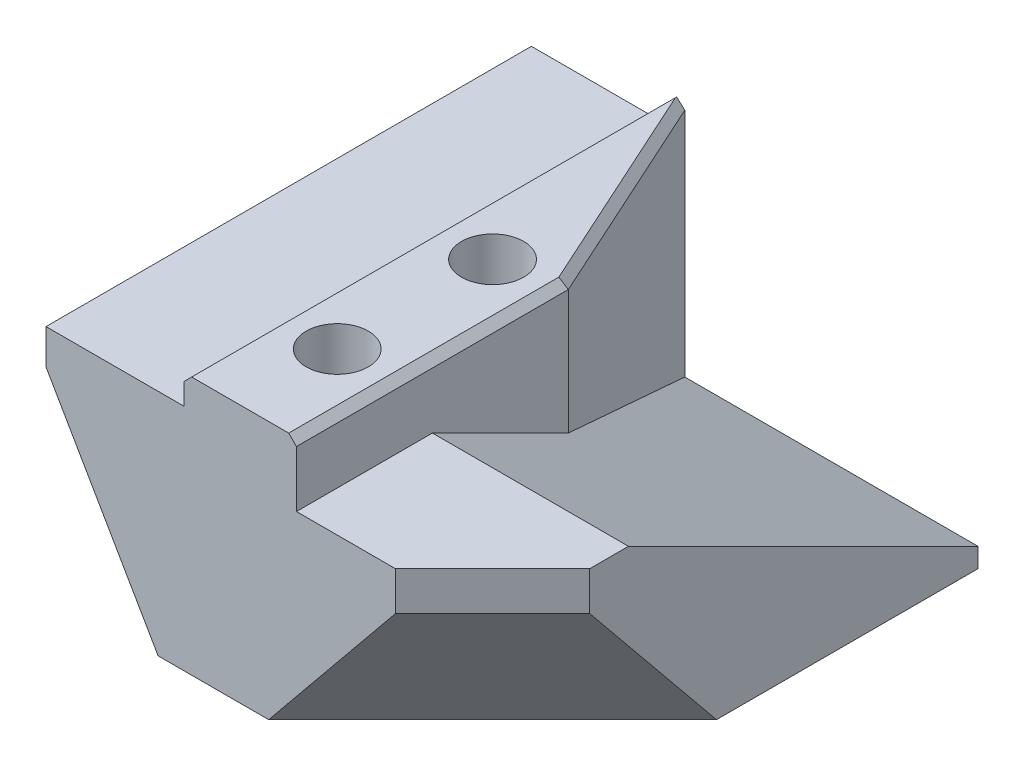
ISO-10303-21;
HEADER;
FILE_DESCRIPTION(('STEP AP214'),'2;1');
FILE_NAME('part.step','',(''),(''),'','','');
FILE_SCHEMA(('AUTOMOTIVE_DESIGN { 1 0 10303 214 1 1 1 1 }'));
ENDSEC;
DATA;
#1=APPLICATION_CONTEXT('core data for automotive mechanical design processes');
#2=APPLICATION_PROTOCOL_DEFINITION('international standard','automotive_design',2000,#1);
#3=PRODUCT_CONTEXT('',#1,'mechanical');
#4=PRODUCT('Part','Part','',(#3));
#5=PRODUCT_RELATED_PRODUCT_CATEGORY('part','',(#4));
#6=PRODUCT_DEFINITION_FORMATION('','',#4);
#7=PRODUCT_DEFINITION_CONTEXT('part definition',#1,'design');
#8=PRODUCT_DEFINITION('design','',#6,#7);
#9=PRODUCT_DEFINITION_SHAPE('','',#8);
#10=(LENGTH_UNIT() NAMED_UNIT(*) SI_UNIT(.MILLI.,.METRE.));
#11=(NAMED_UNIT(*) PLANE_ANGLE_UNIT() SI_UNIT($,.RADIAN.));
#12=(NAMED_UNIT(*) SI_UNIT($,.STERADIAN.) SOLID_ANGLE_UNIT());
#13=UNCERTAINTY_MEASURE_WITH_UNIT(LENGTH_MEASURE(1.E-05),#10,'distance_accuracy_value','');
#14=(GEOMETRIC_REPRESENTATION_CONTEXT(3) GLOBAL_UNCERTAINTY_ASSIGNED_CONTEXT((#13)) GLOBAL_UNIT_ASSIGNED_CONTEXT((#10,
#11,#12)) REPRESENTATION_CONTEXT('',''));
#15=CARTESIAN_POINT('',(0.,0.,0.));
#16=DIRECTION('',(0.,0.,1.));
#17=DIRECTION('',(1.,0.,0.));
#18=AXIS2_PLACEMENT_3D('',#15,#16,#17);
#19=CARTESIAN_POINT('',(12.9,7.8,-20.));
#20=DIRECTION('',(-1.,0.,0.));
#21=DIRECTION('',(0.,0.,1.));
#22=AXIS2_PLACEMENT_3D('',#19,#20,#21);
#23=PLANE('',#22);
#24=DIRECTION('',(0.,1.,0.));
#25=VECTOR('',#24,1.);
#26=CARTESIAN_POINT('',(12.9,-13.0461510298504,-14.));
#27=LINE('',#26,#25);
#28=CARTESIAN_POINT('',(12.9,2.5,-14.));
#29=VERTEX_POINT('',#28);
#30=CARTESIAN_POINT('',(12.9,8.9,-14.));
#31=VERTEX_POINT('',#30);
#32=EDGE_CURVE('E172',#29,#31,#27,.T.);
#33=ORIENTED_EDGE('',*,*,#32,.T.);
#34=DIRECTION('',(0.,0.,1.));
#35=VECTOR('',#34,1.);
#36=CARTESIAN_POINT('',(12.9,8.9,0.));
#37=LINE('',#36,#35);
#38=CARTESIAN_POINT('',(12.9,8.9,0.));
#39=VERTEX_POINT('',#38);
#40=EDGE_CURVE('E65',#31,#39,#37,.T.);
#41=ORIENTED_EDGE('',*,*,#40,.T.);
#42=DIRECTION('',(0.,-1.,0.));
#43=VECTOR('',#42,1.);
#44=CARTESIAN_POINT('',(12.9,7.8,0.));
#45=LINE('',#44,#43);
#46=CARTESIAN_POINT('',(12.9,6.,0.));
#47=VERTEX_POINT('',#46);
#48=EDGE_CURVE('E238',#39,#47,#45,.T.);
#49=ORIENTED_EDGE('',*,*,#48,.T.);
#50=DIRECTION('',(0.,0.,1.));
#51=VECTOR('',#50,1.);
#52=CARTESIAN_POINT('',(12.9,6.,-20.));
#53=LINE('',#52,#51);
#54=CARTESIAN_POINT('',(12.9,6.,-7.));
#55=VERTEX_POINT('',#54);
#56=EDGE_CURVE('E201',#55,#47,#53,.T.);
#57=ORIENTED_EDGE('',*,*,#56,.F.);
#58=DIRECTION('',(0.,-0.447213595499958,-0.894427190999916));
#59=VECTOR('',#58,1.);
#60=CARTESIAN_POINT('',(12.9,6.,-7.));
#61=LINE('',#60,#59);
#62=EDGE_CURVE('E164',#55,#29,#61,.T.);
#63=ORIENTED_EDGE('',*,*,#62,.T.);
#64=EDGE_LOOP('',(#33,#41,#49,#57,#63));
#65=FACE_BOUND('',#64,.T.);
#66=ADVANCED_FACE('F39',(#65),#23,.F.);
#67=CARTESIAN_POINT('',(10.,7.8,-13.));
#68=DIRECTION('',(0.,-1.,0.));
#69=DIRECTION('',(0.,0.,-1.));
#70=AXIS2_PLACEMENT_3D('',#67,#68,#69);
#71=CYLINDRICAL_SURFACE('',#70,1.6);
#72=CARTESIAN_POINT('',(10.,3.90000000000001,-13.));
#73=DIRECTION('',(0.,-1.,0.));
#74=DIRECTION('',(0.,0.,-1.));
#75=AXIS2_PLACEMENT_3D('',#72,#73,#74);
#76=CIRCLE('',#75,1.6);
#77=CARTESIAN_POINT('',(10.,3.90000000000001,-14.6));
#78=VERTEX_POINT('',#77);
#79=EDGE_CURVE('E269',#78,#78,#76,.T.);
#80=ORIENTED_EDGE('',*,*,#79,.T.);
#81=EDGE_LOOP('',(#80));
#82=FACE_BOUND('',#81,.T.);
#83=CARTESIAN_POINT('',(10.,9.3,-13.));
#84=DIRECTION('',(0.,1.,0.));
#85=DIRECTION('',(0.,0.,1.));
#86=AXIS2_PLACEMENT_3D('',#83,#84,#85);
#87=CIRCLE('',#86,1.6);
#88=CARTESIAN_POINT('',(10.,9.3,-11.4));
#89=VERTEX_POINT('',#88);
#90=EDGE_CURVE('E221',#89,#89,#87,.T.);
#91=ORIENTED_EDGE('',*,*,#90,.T.);
#92=EDGE_LOOP('',(#91));
#93=FACE_BOUND('',#92,.T.);
#94=ADVANCED_FACE('F359',(#82,#93),#71,.F.);
#95=CARTESIAN_POINT('',(10.,7.8,-5.));
#96=DIRECTION('',(0.,-1.,0.));
#97=DIRECTION('',(0.,0.,-1.));
#98=AXIS2_PLACEMENT_3D('',#95,#96,#97);
#99=CYLINDRICAL_SURFACE('',#98,1.6);
#100=CARTESIAN_POINT('',(10.,3.90000000000001,-5.));
#101=DIRECTION('',(0.,-1.,0.));
#102=DIRECTION('',(0.,0.,-1.));
#103=AXIS2_PLACEMENT_3D('',#100,#101,#102);
#104=CIRCLE('',#103,1.6);
#105=CARTESIAN_POINT('',(10.,3.90000000000001,-6.6));
#106=VERTEX_POINT('',#105);
#107=EDGE_CURVE('E272',#106,#106,#104,.T.);
#108=ORIENTED_EDGE('',*,*,#107,.T.);
#109=EDGE_LOOP('',(#108));
#110=FACE_BOUND('',#109,.T.);
#111=CARTESIAN_POINT('',(10.,9.3,-5.));
#112=DIRECTION('',(0.,1.,0.));
#113=DIRECTION('',(0.,0.,1.));
#114=AXIS2_PLACEMENT_3D('',#111,#112,#113);
#115=CIRCLE('',#114,1.6);
#116=CARTESIAN_POINT('',(10.,9.3,-3.4));
#117=VERTEX_POINT('',#116);
#118=EDGE_CURVE('E218',#117,#117,#115,.T.);
#119=ORIENTED_EDGE('',*,*,#118,.T.);
#120=EDGE_LOOP('',(#119));
#121=FACE_BOUND('',#120,.T.);
#122=ADVANCED_FACE('F357',(#110,#121),#99,.F.);
#123=CARTESIAN_POINT('',(0.,4.,0.));
#124=DIRECTION('',(1.,0.,0.));
#125=DIRECTION('',(0.,0.,-1.));
#126=AXIS2_PLACEMENT_3D('',#123,#124,#125);
#127=PLANE('',#126);
#128=DIRECTION('',(0.,1.,0.));
#129=VECTOR('',#128,1.);
#130=CARTESIAN_POINT('',(0.,-4.,-25.));
#131=LINE('',#130,#129);
#132=CARTESIAN_POINT('',(0.,6.00000000000006,-25.));
#133=VERTEX_POINT('',#132);
#134=CARTESIAN_POINT('',(0.,7.8,-25.));
#135=VERTEX_POINT('',#134);
#136=EDGE_CURVE('E190',#133,#135,#131,.T.);
#137=ORIENTED_EDGE('',*,*,#136,.F.);
#138=DIRECTION('',(0.,0.,1.));
#139=VECTOR('',#138,1.);
#140=CARTESIAN_POINT('',(0.,6.00000000000006,0.));
#141=LINE('',#140,#139);
#142=CARTESIAN_POINT('',(0.,6.00000000000006,0.));
#143=VERTEX_POINT('',#142);
#144=EDGE_CURVE('E248',#133,#143,#141,.T.);
#145=ORIENTED_EDGE('',*,*,#144,.T.);
#146=DIRECTION('',(0.,-1.,0.));
#147=VECTOR('',#146,1.);
#148=CARTESIAN_POINT('',(0.,4.,0.));
#149=LINE('',#148,#147);
#150=CARTESIAN_POINT('',(0.,7.8,0.));
#151=VERTEX_POINT('',#150);
#152=EDGE_CURVE('E240',#151,#143,#149,.T.);
#153=ORIENTED_EDGE('',*,*,#152,.F.);
#154=DIRECTION('',(0.,0.,1.));
#155=VECTOR('',#154,1.);
#156=CARTESIAN_POINT('',(0.,7.8,-20.));
#157=LINE('',#156,#155);
#158=EDGE_CURVE('E232',#135,#151,#157,.T.);
#159=ORIENTED_EDGE('',*,*,#158,.F.);
#160=EDGE_LOOP('',(#137,#145,#153,#159));
#161=FACE_BOUND('',#160,.T.);
#162=ADVANCED_FACE('F332',(#161),#127,.F.);
#163=CARTESIAN_POINT('',(0.,4.,0.));
#164=DIRECTION('',(0.,0.,-1.));
#165=DIRECTION('',(-1.,0.,0.));
#166=AXIS2_PLACEMENT_3D('',#163,#164,#165);
#167=PLANE('',#166);
#168=ORIENTED_EDGE('',*,*,#48,.F.);
#169=DIRECTION('',(-0.707106781186548,0.707106781186548,0.));
#170=VECTOR('',#169,1.);
#171=CARTESIAN_POINT('',(12.5,9.3,0.));
#172=LINE('',#171,#170);
#173=CARTESIAN_POINT('',(12.5,9.3,0.));
#174=VERTEX_POINT('',#173);
#175=EDGE_CURVE('E49',#39,#174,#172,.T.);
#176=ORIENTED_EDGE('',*,*,#175,.T.);
#177=DIRECTION('',(1.,0.,0.));
#178=VECTOR('',#177,1.);
#179=CARTESIAN_POINT('',(7.1,9.3,0.));
#180=LINE('',#179,#178);
#181=CARTESIAN_POINT('',(7.5,9.3,0.));
#182=VERTEX_POINT('',#181);
#183=EDGE_CURVE('E225',#182,#174,#180,.T.);
#184=ORIENTED_EDGE('',*,*,#183,.F.);
#185=DIRECTION('',(-0.707106781186548,-0.707106781186548,0.));
#186=VECTOR('',#185,1.);
#187=CARTESIAN_POINT('',(7.5,9.3,0.));
#188=LINE('',#187,#186);
#189=CARTESIAN_POINT('',(7.1,8.9,0.));
#190=VERTEX_POINT('',#189);
#191=EDGE_CURVE('E57',#182,#190,#188,.T.);
#192=ORIENTED_EDGE('',*,*,#191,.T.);
#193=DIRECTION('',(0.,-1.,0.));
#194=VECTOR('',#193,1.);
#195=CARTESIAN_POINT('',(7.1,9.3,0.));
#196=LINE('',#195,#194);
#197=CARTESIAN_POINT('',(7.1,7.8,0.));
#198=VERTEX_POINT('',#197);
#199=EDGE_CURVE('E228',#190,#198,#196,.T.);
#200=ORIENTED_EDGE('',*,*,#199,.T.);
#201=DIRECTION('',(1.,0.,0.));
#202=VECTOR('',#201,1.);
#203=CARTESIAN_POINT('',(0.,7.8,0.));
#204=LINE('',#203,#202);
#205=EDGE_CURVE('E235',#151,#198,#204,.T.);
#206=ORIENTED_EDGE('',*,*,#205,.F.);
#207=ORIENTED_EDGE('',*,*,#152,.T.);
#208=DIRECTION('',(0.499999999999998,-0.86602540378444,0.));
#209=VECTOR('',#208,1.);
#210=CARTESIAN_POINT('',(5.77350269189626,-4.,0.));
#211=LINE('',#210,#209);
#212=CARTESIAN_POINT('',(5.77350269189626,-4.,0.));
#213=VERTEX_POINT('',#212);
#214=EDGE_CURVE('E250',#143,#213,#211,.T.);
#215=ORIENTED_EDGE('',*,*,#214,.T.);
#216=DIRECTION('',(-1.,0.,0.));
#217=VECTOR('',#216,1.);
#218=CARTESIAN_POINT('',(23.,-4.,0.));
#219=LINE('',#218,#217);
#220=CARTESIAN_POINT('',(11.4680273525781,-4.,0.));
#221=VERTEX_POINT('',#220);
#222=EDGE_CURVE('E216',#221,#213,#219,.T.);
#223=ORIENTED_EDGE('',*,*,#222,.F.);
#224=DIRECTION('',(-0.632455532033675,-0.774596669241484,0.));
#225=VECTOR('',#224,1.);
#226=CARTESIAN_POINT('',(9.17442188206252,-6.80908153700972,0.));
#227=LINE('',#226,#225);
#228=CARTESIAN_POINT('',(18.,4.00000000000006,0.));
#229=VERTEX_POINT('',#228);
#230=EDGE_CURVE('E263',#221,#229,#227,.F.);
#231=ORIENTED_EDGE('',*,*,#230,.T.);
#232=DIRECTION('',(0.,1.,0.));
#233=VECTOR('',#232,1.);
#234=CARTESIAN_POINT('',(18.,6.,0.));
#235=LINE('',#234,#233);
#236=CARTESIAN_POINT('',(18.,6.,0.));
#237=VERTEX_POINT('',#236);
#238=EDGE_CURVE('E256',#229,#237,#235,.T.);
#239=ORIENTED_EDGE('',*,*,#238,.T.);
#240=DIRECTION('',(1.,0.,0.));
#241=VECTOR('',#240,1.);
#242=CARTESIAN_POINT('',(23.,6.,0.));
#243=LINE('',#242,#241);
#244=EDGE_CURVE('E204',#47,#237,#243,.T.);
#245=ORIENTED_EDGE('',*,*,#244,.F.);
#246=EDGE_LOOP('',(#168,#176,#184,#192,#200,#206,#207,#215,#223,#231,#239,#245));
#247=FACE_BOUND('',#246,.T.);
#248=ADVANCED_FACE('F336',(#247),#167,.F.);
#249=CARTESIAN_POINT('',(0.,7.8,0.));
#250=DIRECTION('',(0.,1.,0.));
#251=DIRECTION('',(0.,0.,1.));
#252=AXIS2_PLACEMENT_3D('',#249,#250,#251);
#253=PLANE('',#252);
#254=DIRECTION('',(0.,0.,1.));
#255=VECTOR('',#254,1.);
#256=CARTESIAN_POINT('',(7.1,7.8,-20.));
#257=LINE('',#256,#255);
#258=CARTESIAN_POINT('',(7.1,7.8,-25.));
#259=VERTEX_POINT('',#258);
#260=EDGE_CURVE('E224',#259,#198,#257,.T.);
#261=ORIENTED_EDGE('',*,*,#260,.F.);
#262=DIRECTION('',(1.,0.,0.));
#263=VECTOR('',#262,1.);
#264=CARTESIAN_POINT('',(0.,7.8,-25.));
#265=LINE('',#264,#263);
#266=EDGE_CURVE('E192',#135,#259,#265,.T.);
#267=ORIENTED_EDGE('',*,*,#266,.F.);
#268=ORIENTED_EDGE('',*,*,#158,.T.);
#269=ORIENTED_EDGE('',*,*,#205,.T.);
#270=EDGE_LOOP('',(#261,#267,#268,#269));
#271=FACE_BOUND('',#270,.T.);
#272=ADVANCED_FACE('F339',(#271),#253,.T.);
#273=CARTESIAN_POINT('',(0.,9.3,0.));
#274=DIRECTION('',(0.,1.,0.));
#275=DIRECTION('',(0.,0.,1.));
#276=AXIS2_PLACEMENT_3D('',#273,#274,#275);
#277=PLANE('',#276);
#278=ORIENTED_EDGE('',*,*,#183,.T.);
#279=DIRECTION('',(0.,0.,-1.));
#280=VECTOR('',#279,1.);
#281=CARTESIAN_POINT('',(12.5,9.3,-14.));
#282=LINE('',#281,#280);
#283=CARTESIAN_POINT('',(12.5,9.3,-13.9133563221124));
#284=VERTEX_POINT('',#283);
#285=EDGE_CURVE('E287',#174,#284,#282,.T.);
#286=ORIENTED_EDGE('',*,*,#285,.T.);
#287=DIRECTION('',(-0.413802944301184,0.,-0.910366477462605));
#288=VECTOR('',#287,1.);
#289=CARTESIAN_POINT('',(7.53585340901495,9.3,-24.8344788222795));
#290=LINE('',#289,#288);
#291=CARTESIAN_POINT('',(7.5,9.3,-24.9133563221124));
#292=VERTEX_POINT('',#291);
#293=EDGE_CURVE('E285',#284,#292,#290,.T.);
#294=ORIENTED_EDGE('',*,*,#293,.T.);
#295=DIRECTION('',(0.,0.,1.));
#296=VECTOR('',#295,1.);
#297=CARTESIAN_POINT('',(7.5,9.3,0.));
#298=LINE('',#297,#296);
#299=EDGE_CURVE('E283',#292,#182,#298,.T.);
#300=ORIENTED_EDGE('',*,*,#299,.T.);
#301=EDGE_LOOP('',(#278,#286,#294,#300));
#302=FACE_BOUND('',#301,.T.);
#303=ORIENTED_EDGE('',*,*,#90,.F.);
#304=EDGE_LOOP('',(#303));
#305=FACE_BOUND('',#304,.T.);
#306=ORIENTED_EDGE('',*,*,#118,.F.);
#307=EDGE_LOOP('',(#306));
#308=FACE_BOUND('',#307,.T.);
#309=ADVANCED_FACE('F349',(#302,#305,#308),#277,.T.);
#310=CARTESIAN_POINT('',(7.1,9.3,-20.));
#311=DIRECTION('',(1.,0.,0.));
#312=DIRECTION('',(0.,0.,-1.));
#313=AXIS2_PLACEMENT_3D('',#310,#311,#312);
#314=PLANE('',#313);
#315=ORIENTED_EDGE('',*,*,#199,.F.);
#316=DIRECTION('',(0.,0.,-1.));
#317=VECTOR('',#316,1.);
#318=CARTESIAN_POINT('',(7.1,8.9,-25.));
#319=LINE('',#318,#317);
#320=CARTESIAN_POINT('',(7.1,8.9,-25.));
#321=VERTEX_POINT('',#320);
#322=EDGE_CURVE('E11',#190,#321,#319,.T.);
#323=ORIENTED_EDGE('',*,*,#322,.T.);
#324=DIRECTION('',(0.,1.,0.));
#325=VECTOR('',#324,1.);
#326=CARTESIAN_POINT('',(7.1,7.8,-25.));
#327=LINE('',#326,#325);
#328=EDGE_CURVE('E195',#259,#321,#327,.T.);
#329=ORIENTED_EDGE('',*,*,#328,.F.);
#330=ORIENTED_EDGE('',*,*,#260,.T.);
#331=EDGE_LOOP('',(#315,#323,#329,#330));
#332=FACE_BOUND('',#331,.T.);
#333=ADVANCED_FACE('F343',(#332),#314,.F.);
#334=CARTESIAN_POINT('',(10.,2.4,-5.));
#335=DIRECTION('',(0.,-1.,0.));
#336=DIRECTION('',(0.,0.,-1.));
#337=AXIS2_PLACEMENT_3D('',#334,#335,#336);
#338=CYLINDRICAL_SURFACE('',#337,3.);
#339=CARTESIAN_POINT('',(10.,2.50000000000002,-5.));
#340=DIRECTION('',(0.,-1.,0.));
#341=DIRECTION('',(0.,0.,-1.));
#342=AXIS2_PLACEMENT_3D('',#339,#340,#341);
#343=CIRCLE('',#342,3.);
#344=CARTESIAN_POINT('',(10.,2.50000000000002,-8.));
#345=VERTEX_POINT('',#344);
#346=EDGE_CURVE('E278',#345,#345,#343,.F.);
#347=ORIENTED_EDGE('',*,*,#346,.T.);
#348=EDGE_LOOP('',(#347));
#349=FACE_BOUND('',#348,.T.);
#350=CARTESIAN_POINT('',(10.,-4.,-5.));
#351=DIRECTION('',(0.,-1.,0.));
#352=DIRECTION('',(0.,0.,-1.));
#353=AXIS2_PLACEMENT_3D('',#350,#351,#352);
#354=CIRCLE('',#353,3.);
#355=CARTESIAN_POINT('',(10.,-4.,-8.));
#356=VERTEX_POINT('',#355);
#357=EDGE_CURVE('E207',#356,#356,#354,.T.);
#358=ORIENTED_EDGE('',*,*,#357,.T.);
#359=EDGE_LOOP('',(#358));
#360=FACE_BOUND('',#359,.T.);
#361=ADVANCED_FACE('F491',(#349,#360),#338,.F.);
#362=CARTESIAN_POINT('',(10.,2.4,-13.));
#363=DIRECTION('',(0.,-1.,0.));
#364=DIRECTION('',(0.,0.,-1.));
#365=AXIS2_PLACEMENT_3D('',#362,#363,#364);
#366=CYLINDRICAL_SURFACE('',#365,3.);
#367=CARTESIAN_POINT('',(10.,2.50000000000002,-13.));
#368=DIRECTION('',(0.,-1.,0.));
#369=DIRECTION('',(0.,0.,-1.));
#370=AXIS2_PLACEMENT_3D('',#367,#368,#369);
#371=CIRCLE('',#370,3.);
#372=CARTESIAN_POINT('',(10.,2.50000000000002,-16.));
#373=VERTEX_POINT('',#372);
#374=EDGE_CURVE('E275',#373,#373,#371,.F.);
#375=ORIENTED_EDGE('',*,*,#374,.T.);
#376=EDGE_LOOP('',(#375));
#377=FACE_BOUND('',#376,.T.);
#378=CARTESIAN_POINT('',(10.,-4.,-13.));
#379=DIRECTION('',(0.,-1.,0.));
#380=DIRECTION('',(0.,0.,-1.));
#381=AXIS2_PLACEMENT_3D('',#378,#379,#380);
#382=CIRCLE('',#381,3.);
#383=CARTESIAN_POINT('',(10.,-4.,-16.));
#384=VERTEX_POINT('',#383);
#385=EDGE_CURVE('E210',#384,#384,#382,.T.);
#386=ORIENTED_EDGE('',*,*,#385,.T.);
#387=EDGE_LOOP('',(#386));
#388=FACE_BOUND('',#387,.T.);
#389=ADVANCED_FACE('F485',(#377,#388),#366,.F.);
#390=CARTESIAN_POINT('',(23.,0.,0.));
#391=DIRECTION('',(1.,0.,0.));
#392=DIRECTION('',(0.,0.,-1.));
#393=AXIS2_PLACEMENT_3D('',#390,#391,#392);
#394=PLANE('',#393);
#395=DIRECTION('',(0.,-0.447213595499958,-0.894427190999916));
#396=VECTOR('',#395,1.);
#397=CARTESIAN_POINT('',(23.,6.,-7.));
#398=LINE('',#397,#396);
#399=CARTESIAN_POINT('',(23.,6.,-7.));
#400=VERTEX_POINT('',#399);
#401=CARTESIAN_POINT('',(23.,-3.,-25.));
#402=VERTEX_POINT('',#401);
#403=EDGE_CURVE('E159',#400,#402,#398,.T.);
#404=ORIENTED_EDGE('',*,*,#403,.F.);
#405=DIRECTION('',(0.,0.,-1.));
#406=VECTOR('',#405,1.);
#407=CARTESIAN_POINT('',(23.,6.,-20.));
#408=LINE('',#407,#406);
#409=CARTESIAN_POINT('',(23.,6.,-5.));
#410=VERTEX_POINT('',#409);
#411=EDGE_CURVE('E198',#410,#400,#408,.T.);
#412=ORIENTED_EDGE('',*,*,#411,.F.);
#413=DIRECTION('',(0.,-1.,0.));
#414=VECTOR('',#413,1.);
#415=CARTESIAN_POINT('',(23.,-4.,-5.));
#416=LINE('',#415,#414);
#417=CARTESIAN_POINT('',(23.,4.00000000000006,-5.));
#418=VERTEX_POINT('',#417);
#419=EDGE_CURVE('E253',#410,#418,#416,.T.);
#420=ORIENTED_EDGE('',*,*,#419,.T.);
#421=DIRECTION('',(0.,0.774596669241486,0.632455532033673));
#422=VECTOR('',#421,1.);
#423=CARTESIAN_POINT('',(23.,4.04948974278318,-4.95959179422659));
#424=LINE('',#423,#422);
#425=CARTESIAN_POINT('',(23.,-4.,-11.5319726474218));
#426=VERTEX_POINT('',#425);
#427=EDGE_CURVE('E267',#418,#426,#424,.F.);
#428=ORIENTED_EDGE('',*,*,#427,.T.);
#429=DIRECTION('',(0.,0.,1.));
#430=VECTOR('',#429,1.);
#431=CARTESIAN_POINT('',(23.,-4.,-20.));
#432=LINE('',#431,#430);
#433=CARTESIAN_POINT('',(23.,-4.,-25.));
#434=VERTEX_POINT('',#433);
#435=EDGE_CURVE('E213',#434,#426,#432,.T.);
#436=ORIENTED_EDGE('',*,*,#435,.F.);
#437=DIRECTION('',(0.,-1.,0.));
#438=VECTOR('',#437,1.);
#439=CARTESIAN_POINT('',(23.,6.,-25.));
#440=LINE('',#439,#438);
#441=EDGE_CURVE('E163',#402,#434,#440,.T.);
#442=ORIENTED_EDGE('',*,*,#441,.F.);
#443=EDGE_LOOP('',(#404,#412,#420,#428,#436,#442));
#444=FACE_BOUND('',#443,.T.);
#445=ADVANCED_FACE('F311',(#444),#394,.T.);
#446=CARTESIAN_POINT('',(0.,-4.,0.));
#447=DIRECTION('',(0.,-1.,0.));
#448=DIRECTION('',(0.,0.,-1.));
#449=AXIS2_PLACEMENT_3D('',#446,#447,#448);
#450=PLANE('',#449);
#451=ORIENTED_EDGE('',*,*,#385,.F.);
#452=EDGE_LOOP('',(#451));
#453=FACE_BOUND('',#452,.T.);
#454=ORIENTED_EDGE('',*,*,#435,.T.);
#455=DIRECTION('',(-0.707106781186549,0.,0.707106781186546));
#456=VECTOR('',#455,1.);
#457=CARTESIAN_POINT('',(5.73401367628905,-4.,5.73401367628907));
#458=LINE('',#457,#456);
#459=EDGE_CURVE('E260',#426,#221,#458,.T.);
#460=ORIENTED_EDGE('',*,*,#459,.T.);
#461=ORIENTED_EDGE('',*,*,#222,.T.);
#462=DIRECTION('',(0.,0.,-1.));
#463=VECTOR('',#462,1.);
#464=CARTESIAN_POINT('',(5.77350269189626,-4.,-25.));
#465=LINE('',#464,#463);
#466=CARTESIAN_POINT('',(5.77350269189626,-4.,-25.));
#467=VERTEX_POINT('',#466);
#468=EDGE_CURVE('E243',#213,#467,#465,.T.);
#469=ORIENTED_EDGE('',*,*,#468,.T.);
#470=DIRECTION('',(-1.,0.,0.));
#471=VECTOR('',#470,1.);
#472=CARTESIAN_POINT('',(23.,-4.,-25.));
#473=LINE('',#472,#471);
#474=EDGE_CURVE('E187',#434,#467,#473,.T.);
#475=ORIENTED_EDGE('',*,*,#474,.F.);
#476=EDGE_LOOP('',(#454,#460,#461,#469,#475));
#477=FACE_BOUND('',#476,.T.);
#478=ORIENTED_EDGE('',*,*,#357,.F.);
#479=EDGE_LOOP('',(#478));
#480=FACE_BOUND('',#479,.T.);
#481=ADVANCED_FACE('F323',(#453,#477,#480),#450,.T.);
#482=CARTESIAN_POINT('',(0.,6.,0.));
#483=DIRECTION('',(0.,-1.,0.));
#484=DIRECTION('',(0.,0.,-1.));
#485=AXIS2_PLACEMENT_3D('',#482,#483,#484);
#486=PLANE('',#485);
#487=ORIENTED_EDGE('',*,*,#411,.T.);
#488=DIRECTION('',(1.,0.,0.));
#489=VECTOR('',#488,1.);
#490=CARTESIAN_POINT('',(-7.2246117974981,6.,-7.));
#491=LINE('',#490,#489);
#492=EDGE_CURVE('E183',#55,#400,#491,.T.);
#493=ORIENTED_EDGE('',*,*,#492,.F.);
#494=ORIENTED_EDGE('',*,*,#56,.T.);
#495=ORIENTED_EDGE('',*,*,#244,.T.);
#496=DIRECTION('',(0.707106781186549,0.,-0.707106781186546));
#497=VECTOR('',#496,1.);
#498=CARTESIAN_POINT('',(23.,6.,-5.));
#499=LINE('',#498,#497);
#500=EDGE_CURVE('E258',#237,#410,#499,.T.);
#501=ORIENTED_EDGE('',*,*,#500,.T.);
#502=EDGE_LOOP('',(#487,#493,#494,#495,#501));
#503=FACE_BOUND('',#502,.T.);
#504=ADVANCED_FACE('F305',(#503),#486,.F.);
#505=CARTESIAN_POINT('',(0.,0.,-25.));
#506=DIRECTION('',(0.,0.,-1.));
#507=DIRECTION('',(-1.,0.,0.));
#508=AXIS2_PLACEMENT_3D('',#505,#506,#507);
#509=PLANE('',#508);
#510=DIRECTION('',(0.707106781186548,0.707106781186548,0.));
#511=VECTOR('',#510,1.);
#512=CARTESIAN_POINT('',(-0.899999999999999,0.899999999999999,-25.));
#513=LINE('',#512,#511);
#514=CARTESIAN_POINT('',(7.48123218270529,9.28123218270528,-25.));
#515=VERTEX_POINT('',#514);
#516=EDGE_CURVE('E289',#321,#515,#513,.T.);
#517=ORIENTED_EDGE('',*,*,#516,.T.);
#518=DIRECTION('',(0.739470404682127,-0.673189067498315,0.));
#519=VECTOR('',#518,1.);
#520=CARTESIAN_POINT('',(8.01060000305209,8.79931346481411,-25.));
#521=LINE('',#520,#519);
#522=CARTESIAN_POINT('',(7.9,8.9,-25.));
#523=VERTEX_POINT('',#522);
#524=EDGE_CURVE('E176',#515,#523,#521,.T.);
#525=ORIENTED_EDGE('',*,*,#524,.T.);
#526=DIRECTION('',(0.,1.,0.));
#527=VECTOR('',#526,1.);
#528=CARTESIAN_POINT('',(7.9,-13.0461510298504,-25.));
#529=LINE('',#528,#527);
#530=CARTESIAN_POINT('',(7.9,-3.,-25.));
#531=VERTEX_POINT('',#530);
#532=EDGE_CURVE('E170',#531,#523,#529,.T.);
#533=ORIENTED_EDGE('',*,*,#532,.F.);
#534=DIRECTION('',(1.,0.,0.));
#535=VECTOR('',#534,1.);
#536=CARTESIAN_POINT('',(-7.2246117974981,-3.,-25.));
#537=LINE('',#536,#535);
#538=EDGE_CURVE('E153',#531,#402,#537,.T.);
#539=ORIENTED_EDGE('',*,*,#538,.T.);
#540=ORIENTED_EDGE('',*,*,#441,.T.);
#541=ORIENTED_EDGE('',*,*,#474,.T.);
#542=DIRECTION('',(-0.499999999999998,0.86602540378444,0.));
#543=VECTOR('',#542,1.);
#544=CARTESIAN_POINT('',(2.59807621135334,1.5,-25.));
#545=LINE('',#544,#543);
#546=EDGE_CURVE('E246',#467,#133,#545,.T.);
#547=ORIENTED_EDGE('',*,*,#546,.T.);
#548=ORIENTED_EDGE('',*,*,#136,.T.);
#549=ORIENTED_EDGE('',*,*,#266,.T.);
#550=ORIENTED_EDGE('',*,*,#328,.T.);
#551=EDGE_LOOP('',(#517,#525,#533,#539,#540,#541,#547,#548,#549,#550));
#552=FACE_BOUND('',#551,.T.);
#553=ADVANCED_FACE('F174',(#552),#509,.T.);
#554=CARTESIAN_POINT('',(5.77350269189626,-4.,0.));
#555=DIRECTION('',(-0.86602540378444,-0.499999999999998,0.));
#556=DIRECTION('',(0.,0.,1.));
#557=AXIS2_PLACEMENT_3D('',#554,#555,#556);
#558=PLANE('',#557);
#559=ORIENTED_EDGE('',*,*,#214,.F.);
#560=ORIENTED_EDGE('',*,*,#144,.F.);
#561=ORIENTED_EDGE('',*,*,#546,.F.);
#562=ORIENTED_EDGE('',*,*,#468,.F.);
#563=EDGE_LOOP('',(#559,#560,#561,#562));
#564=FACE_BOUND('',#563,.T.);
#565=ADVANCED_FACE('F335',(#564),#558,.T.);
#566=CARTESIAN_POINT('',(23.,0.,-5.));
#567=DIRECTION('',(0.707106781186546,0.,0.707106781186549));
#568=DIRECTION('',(0.,1.,0.));
#569=AXIS2_PLACEMENT_3D('',#566,#567,#568);
#570=PLANE('',#569);
#571=ORIENTED_EDGE('',*,*,#238,.F.);
#572=DIRECTION('',(0.707106781186549,0.,-0.707106781186546));
#573=VECTOR('',#572,1.);
#574=CARTESIAN_POINT('',(23.,4.00000000000006,-5.));
#575=LINE('',#574,#573);
#576=EDGE_CURVE('E265',#229,#418,#575,.T.);
#577=ORIENTED_EDGE('',*,*,#576,.T.);
#578=ORIENTED_EDGE('',*,*,#419,.F.);
#579=ORIENTED_EDGE('',*,*,#500,.F.);
#580=EDGE_LOOP('',(#571,#577,#578,#579));
#581=FACE_BOUND('',#580,.T.);
#582=ADVANCED_FACE('F315',(#581),#570,.T.);
#583=CARTESIAN_POINT('',(5.73401367628905,-4.,5.73401367628907));
#584=DIRECTION('',(-0.612372435695794,0.499999999999998,-0.612372435695797));
#585=DIRECTION('',(-0.707106781186549,0.,0.707106781186546));
#586=AXIS2_PLACEMENT_3D('',#583,#584,#585);
#587=PLANE('',#586);
#588=ORIENTED_EDGE('',*,*,#427,.F.);
#589=ORIENTED_EDGE('',*,*,#576,.F.);
#590=ORIENTED_EDGE('',*,*,#230,.F.);
#591=ORIENTED_EDGE('',*,*,#459,.F.);
#592=EDGE_LOOP('',(#588,#589,#590,#591));
#593=FACE_BOUND('',#592,.T.);
#594=ADVANCED_FACE('F318',(#593),#587,.F.);
#595=CARTESIAN_POINT('',(-7.2246117974981,6.,-7.));
#596=DIRECTION('',(0.,-0.894427190999916,0.447213595499958));
#597=DIRECTION('',(0.,-0.447213595499958,-0.894427190999916));
#598=AXIS2_PLACEMENT_3D('',#595,#596,#597);
#599=PLANE('',#598);
#600=ORIENTED_EDGE('',*,*,#492,.T.);
#601=ORIENTED_EDGE('',*,*,#403,.T.);
#602=ORIENTED_EDGE('',*,*,#538,.F.);
#603=DIRECTION('',(0.376621788577355,0.41428396743509,0.82856793487018));
#604=VECTOR('',#603,1.);
#605=CARTESIAN_POINT('',(10.4743594137822,-0.168204644839576,-19.3364092896792));
#606=LINE('',#605,#604);
#607=EDGE_CURVE('E156',#531,#29,#606,.T.);
#608=ORIENTED_EDGE('',*,*,#607,.T.);
#609=ORIENTED_EDGE('',*,*,#62,.F.);
#610=EDGE_LOOP('',(#600,#601,#602,#608,#609));
#611=FACE_BOUND('',#610,.T.);
#612=ADVANCED_FACE('F155',(#611),#599,.F.);
#613=CARTESIAN_POINT('',(12.9,-13.0461510298504,-14.));
#614=DIRECTION('',(-0.910366477462605,0.,0.413802944301184));
#615=DIRECTION('',(0.413802944301184,0.,0.910366477462605));
#616=AXIS2_PLACEMENT_3D('',#613,#614,#615);
#617=PLANE('',#616);
#618=ORIENTED_EDGE('',*,*,#532,.T.);
#619=DIRECTION('',(0.413802944301184,0.,0.910366477462605));
#620=VECTOR('',#619,1.);
#621=CARTESIAN_POINT('',(12.9,8.9,-14.));
#622=LINE('',#621,#620);
#623=EDGE_CURVE('E281',#523,#31,#622,.T.);
#624=ORIENTED_EDGE('',*,*,#623,.T.);
#625=ORIENTED_EDGE('',*,*,#32,.F.);
#626=ORIENTED_EDGE('',*,*,#607,.F.);
#627=EDGE_LOOP('',(#618,#624,#625,#626));
#628=FACE_BOUND('',#627,.T.);
#629=ADVANCED_FACE('F168',(#628),#617,.F.);
#630=CARTESIAN_POINT('',(10.,2.4,-13.));
#631=DIRECTION('',(0.,-1.,0.));
#632=DIRECTION('',(0.,0.,-1.));
#633=AXIS2_PLACEMENT_3D('',#630,#631,#632);
#634=CONICAL_SURFACE('',#633,3.10000000000003,0.785398163397453);
#635=ORIENTED_EDGE('',*,*,#79,.F.);
#636=EDGE_LOOP('',(#635));
#637=FACE_BOUND('',#636,.T.);
#638=ORIENTED_EDGE('',*,*,#374,.F.);
#639=EDGE_LOOP('',(#638));
#640=FACE_BOUND('',#639,.T.);
#641=ADVANCED_FACE('F395',(#637,#640),#634,.F.);
#642=CARTESIAN_POINT('',(10.,2.4,-5.));
#643=DIRECTION('',(0.,-1.,0.));
#644=DIRECTION('',(0.,0.,-1.));
#645=AXIS2_PLACEMENT_3D('',#642,#643,#644);
#646=CONICAL_SURFACE('',#645,3.10000000000003,0.785398163397453);
#647=ORIENTED_EDGE('',*,*,#107,.F.);
#648=EDGE_LOOP('',(#647));
#649=FACE_BOUND('',#648,.T.);
#650=ORIENTED_EDGE('',*,*,#346,.F.);
#651=EDGE_LOOP('',(#650));
#652=FACE_BOUND('',#651,.T.);
#653=ADVANCED_FACE('F401',(#649,#652),#646,.F.);
#654=CARTESIAN_POINT('',(7.5,9.3,0.));
#655=DIRECTION('',(-0.707106781186547,0.707106781186547,0.));
#656=DIRECTION('',(0.,0.,-1.));
#657=AXIS2_PLACEMENT_3D('',#654,#655,#656);
#658=PLANE('',#657);
#659=ORIENTED_EDGE('',*,*,#191,.F.);
#660=ORIENTED_EDGE('',*,*,#299,.F.);
#661=DIRECTION('',(-0.207109570842063,-0.207109570842063,-0.956143949063755));
#662=VECTOR('',#661,1.);
#663=CARTESIAN_POINT('',(12.433506324112,14.233506324112,-2.13728566401314));
#664=LINE('',#663,#662);
#665=EDGE_CURVE('E44',#515,#292,#664,.F.);
#666=ORIENTED_EDGE('',*,*,#665,.F.);
#667=ORIENTED_EDGE('',*,*,#516,.F.);
#668=ORIENTED_EDGE('',*,*,#322,.F.);
#669=EDGE_LOOP('',(#659,#660,#666,#667,#668));
#670=FACE_BOUND('',#669,.T.);
#671=ADVANCED_FACE('F42',(#670),#658,.T.);
#672=CARTESIAN_POINT('',(12.5,9.3,0.));
#673=DIRECTION('',(0.707106781186547,0.707106781186547,0.));
#674=DIRECTION('',(0.,0.,1.));
#675=AXIS2_PLACEMENT_3D('',#672,#673,#674);
#676=PLANE('',#675);
#677=ORIENTED_EDGE('',*,*,#175,.F.);
#678=ORIENTED_EDGE('',*,*,#40,.F.);
#679=DIRECTION('',(-0.698955640180202,0.698955640180202,0.151400218363677));
#680=VECTOR('',#679,1.);
#681=CARTESIAN_POINT('',(11.0276602987509,10.7723397012491,-13.5944340050722));
#682=LINE('',#681,#680);
#683=EDGE_CURVE('E179',#284,#31,#682,.F.);
#684=ORIENTED_EDGE('',*,*,#683,.F.);
#685=ORIENTED_EDGE('',*,*,#285,.F.);
#686=EDGE_LOOP('',(#677,#678,#684,#685));
#687=FACE_BOUND('',#686,.T.);
#688=ADVANCED_FACE('F301',(#687),#676,.T.);
#689=CARTESIAN_POINT('',(12.9,8.9,-14.));
#690=DIRECTION('',(0.643726309578718,0.707106781186547,-0.292602867990326));
#691=DIRECTION('',(-0.413802944301184,0.,-0.910366477462605));
#692=AXIS2_PLACEMENT_3D('',#689,#690,#691);
#693=PLANE('',#692);
#694=ORIENTED_EDGE('',*,*,#665,.T.);
#695=ORIENTED_EDGE('',*,*,#293,.F.);
#696=ORIENTED_EDGE('',*,*,#683,.T.);
#697=ORIENTED_EDGE('',*,*,#623,.F.);
#698=ORIENTED_EDGE('',*,*,#524,.F.);
#699=EDGE_LOOP('',(#694,#695,#696,#697,#698));
#700=FACE_BOUND('',#699,.T.);
#701=ADVANCED_FACE('F297',(#700),#693,.T.);
#702=CLOSED_SHELL('',(#66,#94,#122,#162,#248,#272,#309,#333,#361,#389,#445,#481,#504,#553,#565,
#582,#594,#612,#629,#641,#653,#671,#688,#701));
#703=MANIFOLD_SOLID_BREP('B2',#702);
#704=ADVANCED_BREP_SHAPE_REPRESENTATION('',(#18,#703),#14);
#705=SHAPE_DEFINITION_REPRESENTATION(#9,#704);
ENDSEC;
END-ISO-10303-21;
